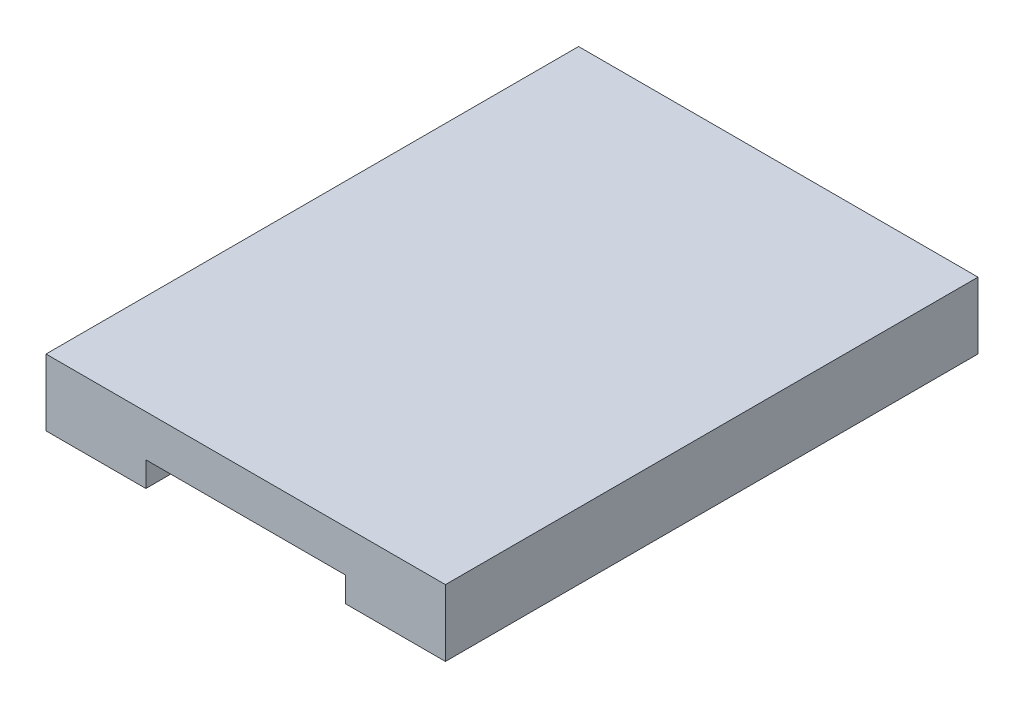
ISO-10303-21;
HEADER;
FILE_DESCRIPTION(('STEP AP214'),'2;1');
FILE_NAME('part.step','',(''),(''),'','','');
FILE_SCHEMA(('AUTOMOTIVE_DESIGN { 1 0 10303 214 1 1 1 1 }'));
ENDSEC;
DATA;
#1=APPLICATION_CONTEXT('core data for automotive mechanical design processes');
#2=APPLICATION_PROTOCOL_DEFINITION('international standard','automotive_design',2000,#1);
#3=PRODUCT_CONTEXT('',#1,'mechanical');
#4=PRODUCT('Part','Part','',(#3));
#5=PRODUCT_RELATED_PRODUCT_CATEGORY('part','',(#4));
#6=PRODUCT_DEFINITION_FORMATION('','',#4);
#7=PRODUCT_DEFINITION_CONTEXT('part definition',#1,'design');
#8=PRODUCT_DEFINITION('design','',#6,#7);
#9=PRODUCT_DEFINITION_SHAPE('','',#8);
#10=(LENGTH_UNIT() NAMED_UNIT(*) SI_UNIT(.MILLI.,.METRE.));
#11=(NAMED_UNIT(*) PLANE_ANGLE_UNIT() SI_UNIT($,.RADIAN.));
#12=(NAMED_UNIT(*) SI_UNIT($,.STERADIAN.) SOLID_ANGLE_UNIT());
#13=UNCERTAINTY_MEASURE_WITH_UNIT(LENGTH_MEASURE(1.E-05),#10,'distance_accuracy_value','');
#14=(GEOMETRIC_REPRESENTATION_CONTEXT(3) GLOBAL_UNCERTAINTY_ASSIGNED_CONTEXT((#13)) GLOBAL_UNIT_ASSIGNED_CONTEXT((#10,
#11,#12)) REPRESENTATION_CONTEXT('',''));
#15=CARTESIAN_POINT('',(0.,0.,0.));
#16=DIRECTION('',(0.,0.,1.));
#17=DIRECTION('',(1.,0.,0.));
#18=AXIS2_PLACEMENT_3D('',#15,#16,#17);
#19=CARTESIAN_POINT('',(38.1,12.7,-50.8));
#20=DIRECTION('',(-1.,0.,0.));
#21=DIRECTION('',(0.,0.,1.));
#22=AXIS2_PLACEMENT_3D('',#19,#20,#21);
#23=PLANE('',#22);
#24=DIRECTION('',(0.,0.,-1.));
#25=VECTOR('',#24,1.);
#26=CARTESIAN_POINT('',(38.1,0.,-50.8));
#27=LINE('',#26,#25);
#28=CARTESIAN_POINT('',(38.1,0.,50.8));
#29=VERTEX_POINT('',#28);
#30=CARTESIAN_POINT('',(38.1,0.,-50.8));
#31=VERTEX_POINT('',#30);
#32=EDGE_CURVE('E141',#29,#31,#27,.T.);
#33=ORIENTED_EDGE('',*,*,#32,.T.);
#34=DIRECTION('',(0.,-1.,0.));
#35=VECTOR('',#34,1.);
#36=CARTESIAN_POINT('',(38.1,12.7,-50.8));
#37=LINE('',#36,#35);
#38=CARTESIAN_POINT('',(38.1,12.7,-50.8));
#39=VERTEX_POINT('',#38);
#40=EDGE_CURVE('E11',#39,#31,#37,.T.);
#41=ORIENTED_EDGE('',*,*,#40,.F.);
#42=DIRECTION('',(0.,0.,-1.));
#43=VECTOR('',#42,1.);
#44=CARTESIAN_POINT('',(38.1,12.7,-50.8));
#45=LINE('',#44,#43);
#46=CARTESIAN_POINT('',(38.1,12.7,50.8));
#47=VERTEX_POINT('',#46);
#48=EDGE_CURVE('E145',#47,#39,#45,.T.);
#49=ORIENTED_EDGE('',*,*,#48,.F.);
#50=DIRECTION('',(0.,-1.,0.));
#51=VECTOR('',#50,1.);
#52=CARTESIAN_POINT('',(38.1,12.7,50.8));
#53=LINE('',#52,#51);
#54=EDGE_CURVE('E152',#47,#29,#53,.T.);
#55=ORIENTED_EDGE('',*,*,#54,.T.);
#56=EDGE_LOOP('',(#33,#41,#49,#55));
#57=FACE_BOUND('',#56,.T.);
#58=ADVANCED_FACE('F33',(#57),#23,.F.);
#59=CARTESIAN_POINT('',(-38.1,12.7,-50.8));
#60=DIRECTION('',(0.,0.,1.));
#61=DIRECTION('',(1.,0.,0.));
#62=AXIS2_PLACEMENT_3D('',#59,#60,#61);
#63=PLANE('',#62);
#64=CARTESIAN_POINT('',(0.,6.35,-50.8));
#65=DIRECTION('',(0.,0.,-1.));
#66=DIRECTION('',(-1.,0.,0.));
#67=AXIS2_PLACEMENT_3D('',#64,#65,#66);
#68=CIRCLE('',#67,3.81);
#69=CARTESIAN_POINT('',(-3.81000000000001,6.35,-50.8));
#70=VERTEX_POINT('',#69);
#71=EDGE_CURVE('E131',#70,#70,#68,.T.);
#72=ORIENTED_EDGE('',*,*,#71,.F.);
#73=EDGE_LOOP('',(#72));
#74=FACE_BOUND('',#73,.T.);
#75=DIRECTION('',(-1.,0.,0.));
#76=VECTOR('',#75,1.);
#77=CARTESIAN_POINT('',(-38.1,0.,-50.8));
#78=LINE('',#77,#76);
#79=CARTESIAN_POINT('',(-38.1,0.,-50.8));
#80=VERTEX_POINT('',#79);
#81=EDGE_CURVE('E155',#31,#80,#78,.T.);
#82=ORIENTED_EDGE('',*,*,#81,.T.);
#83=DIRECTION('',(0.,-1.,0.));
#84=VECTOR('',#83,1.);
#85=CARTESIAN_POINT('',(-38.1,12.7,-50.8));
#86=LINE('',#85,#84);
#87=CARTESIAN_POINT('',(-38.1,12.7,-50.8));
#88=VERTEX_POINT('',#87);
#89=EDGE_CURVE('E40',#88,#80,#86,.T.);
#90=ORIENTED_EDGE('',*,*,#89,.F.);
#91=DIRECTION('',(-1.,0.,0.));
#92=VECTOR('',#91,1.);
#93=CARTESIAN_POINT('',(-38.1,12.7,-50.8));
#94=LINE('',#93,#92);
#95=EDGE_CURVE('E84',#39,#88,#94,.T.);
#96=ORIENTED_EDGE('',*,*,#95,.F.);
#97=ORIENTED_EDGE('',*,*,#40,.T.);
#98=EDGE_LOOP('',(#82,#90,#96,#97));
#99=FACE_BOUND('',#98,.T.);
#100=ADVANCED_FACE('F189',(#74,#99),#63,.F.);
#101=CARTESIAN_POINT('',(-38.1,12.7,-50.8));
#102=DIRECTION('',(1.,0.,0.));
#103=DIRECTION('',(0.,0.,-1.));
#104=AXIS2_PLACEMENT_3D('',#101,#102,#103);
#105=PLANE('',#104);
#106=DIRECTION('',(0.,0.,1.));
#107=VECTOR('',#106,1.);
#108=CARTESIAN_POINT('',(-38.1,0.,-50.8));
#109=LINE('',#108,#107);
#110=CARTESIAN_POINT('',(-38.1,0.,50.8));
#111=VERTEX_POINT('',#110);
#112=EDGE_CURVE('E157',#80,#111,#109,.T.);
#113=ORIENTED_EDGE('',*,*,#112,.T.);
#114=DIRECTION('',(0.,-1.,0.));
#115=VECTOR('',#114,1.);
#116=CARTESIAN_POINT('',(-38.1,12.7,50.8));
#117=LINE('',#116,#115);
#118=CARTESIAN_POINT('',(-38.1,12.7,50.8));
#119=VERTEX_POINT('',#118);
#120=EDGE_CURVE('E162',#119,#111,#117,.T.);
#121=ORIENTED_EDGE('',*,*,#120,.F.);
#122=DIRECTION('',(0.,0.,1.));
#123=VECTOR('',#122,1.);
#124=CARTESIAN_POINT('',(-38.1,12.7,-50.8));
#125=LINE('',#124,#123);
#126=EDGE_CURVE('E149',#88,#119,#125,.T.);
#127=ORIENTED_EDGE('',*,*,#126,.F.);
#128=ORIENTED_EDGE('',*,*,#89,.T.);
#129=EDGE_LOOP('',(#113,#121,#127,#128));
#130=FACE_BOUND('',#129,.T.);
#131=ADVANCED_FACE('F168',(#130),#105,.F.);
#132=CARTESIAN_POINT('',(-38.1,12.7,50.8));
#133=DIRECTION('',(0.,0.,-1.));
#134=DIRECTION('',(-1.,0.,0.));
#135=AXIS2_PLACEMENT_3D('',#132,#133,#134);
#136=PLANE('',#135);
#137=DIRECTION('',(1.,0.,0.));
#138=VECTOR('',#137,1.);
#139=CARTESIAN_POINT('',(-38.1,0.,50.8));
#140=LINE('',#139,#138);
#141=CARTESIAN_POINT('',(-19.05,0.,50.8));
#142=VERTEX_POINT('',#141);
#143=EDGE_CURVE('E147',#111,#142,#140,.T.);
#144=ORIENTED_EDGE('',*,*,#143,.T.);
#145=DIRECTION('',(0.,-1.,0.));
#146=VECTOR('',#145,1.);
#147=CARTESIAN_POINT('',(-19.05,4.7498,50.8));
#148=LINE('',#147,#146);
#149=CARTESIAN_POINT('',(-19.05,4.7498,50.8));
#150=VERTEX_POINT('',#149);
#151=EDGE_CURVE('E139',#150,#142,#148,.T.);
#152=ORIENTED_EDGE('',*,*,#151,.F.);
#153=DIRECTION('',(-1.,0.,0.));
#154=VECTOR('',#153,1.);
#155=CARTESIAN_POINT('',(-19.05,4.7498,50.8));
#156=LINE('',#155,#154);
#157=CARTESIAN_POINT('',(19.05,4.7498,50.8));
#158=VERTEX_POINT('',#157);
#159=EDGE_CURVE('E113',#158,#150,#156,.T.);
#160=ORIENTED_EDGE('',*,*,#159,.F.);
#161=DIRECTION('',(0.,-1.,0.));
#162=VECTOR('',#161,1.);
#163=CARTESIAN_POINT('',(19.05,4.7498,50.8));
#164=LINE('',#163,#162);
#165=CARTESIAN_POINT('',(19.05,0.,50.8));
#166=VERTEX_POINT('',#165);
#167=EDGE_CURVE('E142',#158,#166,#164,.T.);
#168=ORIENTED_EDGE('',*,*,#167,.T.);
#169=EDGE_CURVE('E77',#166,#29,#140,.T.);
#170=ORIENTED_EDGE('',*,*,#169,.T.);
#171=ORIENTED_EDGE('',*,*,#54,.F.);
#172=DIRECTION('',(1.,0.,0.));
#173=VECTOR('',#172,1.);
#174=CARTESIAN_POINT('',(-38.1,12.7,50.8));
#175=LINE('',#174,#173);
#176=EDGE_CURVE('E56',#119,#47,#175,.T.);
#177=ORIENTED_EDGE('',*,*,#176,.F.);
#178=ORIENTED_EDGE('',*,*,#120,.T.);
#179=EDGE_LOOP('',(#144,#152,#160,#168,#170,#171,#177,#178));
#180=FACE_BOUND('',#179,.T.);
#181=ADVANCED_FACE('F174',(#180),#136,.F.);
#182=CARTESIAN_POINT('',(0.,12.7,0.));
#183=DIRECTION('',(0.,1.,0.));
#184=DIRECTION('',(0.,0.,1.));
#185=AXIS2_PLACEMENT_3D('',#182,#183,#184);
#186=PLANE('',#185);
#187=ORIENTED_EDGE('',*,*,#48,.T.);
#188=ORIENTED_EDGE('',*,*,#95,.T.);
#189=ORIENTED_EDGE('',*,*,#126,.T.);
#190=ORIENTED_EDGE('',*,*,#176,.T.);
#191=EDGE_LOOP('',(#187,#188,#189,#190));
#192=FACE_BOUND('',#191,.T.);
#193=ADVANCED_FACE('F178',(#192),#186,.T.);
#194=CARTESIAN_POINT('',(0.,0.,0.));
#195=DIRECTION('',(0.,1.,0.));
#196=DIRECTION('',(0.,0.,1.));
#197=AXIS2_PLACEMENT_3D('',#194,#195,#196);
#198=PLANE('',#197);
#199=DIRECTION('',(1.,0.,0.));
#200=VECTOR('',#199,1.);
#201=CARTESIAN_POINT('',(-19.05,0.,30.1498));
#202=LINE('',#201,#200);
#203=CARTESIAN_POINT('',(-19.05,0.,30.1498));
#204=VERTEX_POINT('',#203);
#205=CARTESIAN_POINT('',(19.05,0.,30.1498));
#206=VERTEX_POINT('',#205);
#207=EDGE_CURVE('E128',#204,#206,#202,.T.);
#208=ORIENTED_EDGE('',*,*,#207,.F.);
#209=DIRECTION('',(0.,0.,-1.));
#210=VECTOR('',#209,1.);
#211=CARTESIAN_POINT('',(-19.05,0.,50.8));
#212=LINE('',#211,#210);
#213=EDGE_CURVE('E47',#142,#204,#212,.T.);
#214=ORIENTED_EDGE('',*,*,#213,.F.);
#215=ORIENTED_EDGE('',*,*,#143,.F.);
#216=ORIENTED_EDGE('',*,*,#112,.F.);
#217=ORIENTED_EDGE('',*,*,#81,.F.);
#218=ORIENTED_EDGE('',*,*,#32,.F.);
#219=ORIENTED_EDGE('',*,*,#169,.F.);
#220=DIRECTION('',(0.,0.,1.));
#221=VECTOR('',#220,1.);
#222=CARTESIAN_POINT('',(19.05,0.,50.8));
#223=LINE('',#222,#221);
#224=EDGE_CURVE('E126',#206,#166,#223,.T.);
#225=ORIENTED_EDGE('',*,*,#224,.F.);
#226=EDGE_LOOP('',(#208,#214,#215,#216,#217,#218,#219,#225));
#227=FACE_BOUND('',#226,.T.);
#228=ADVANCED_FACE('F172',(#227),#198,.F.);
#229=CARTESIAN_POINT('',(-19.05,4.7498,50.8));
#230=DIRECTION('',(-1.,0.,0.));
#231=DIRECTION('',(0.,0.,1.));
#232=AXIS2_PLACEMENT_3D('',#229,#230,#231);
#233=PLANE('',#232);
#234=ORIENTED_EDGE('',*,*,#213,.T.);
#235=DIRECTION('',(0.,-1.,0.));
#236=VECTOR('',#235,1.);
#237=CARTESIAN_POINT('',(-19.05,4.7498,30.1498));
#238=LINE('',#237,#236);
#239=CARTESIAN_POINT('',(-19.05,4.7498,30.1498));
#240=VERTEX_POINT('',#239);
#241=EDGE_CURVE('E103',#240,#204,#238,.T.);
#242=ORIENTED_EDGE('',*,*,#241,.F.);
#243=DIRECTION('',(0.,0.,-1.));
#244=VECTOR('',#243,1.);
#245=CARTESIAN_POINT('',(-19.05,4.7498,50.8));
#246=LINE('',#245,#244);
#247=EDGE_CURVE('E107',#150,#240,#246,.T.);
#248=ORIENTED_EDGE('',*,*,#247,.F.);
#249=ORIENTED_EDGE('',*,*,#151,.T.);
#250=EDGE_LOOP('',(#234,#242,#248,#249));
#251=FACE_BOUND('',#250,.T.);
#252=ADVANCED_FACE('F105',(#251),#233,.F.);
#253=CARTESIAN_POINT('',(19.05,4.7498,50.8));
#254=DIRECTION('',(1.,0.,0.));
#255=DIRECTION('',(0.,0.,-1.));
#256=AXIS2_PLACEMENT_3D('',#253,#254,#255);
#257=PLANE('',#256);
#258=ORIENTED_EDGE('',*,*,#224,.T.);
#259=ORIENTED_EDGE('',*,*,#167,.F.);
#260=DIRECTION('',(0.,0.,1.));
#261=VECTOR('',#260,1.);
#262=CARTESIAN_POINT('',(19.05,4.7498,50.8));
#263=LINE('',#262,#261);
#264=CARTESIAN_POINT('',(19.05,4.7498,30.1498));
#265=VERTEX_POINT('',#264);
#266=EDGE_CURVE('E121',#265,#158,#263,.T.);
#267=ORIENTED_EDGE('',*,*,#266,.F.);
#268=DIRECTION('',(0.,-1.,0.));
#269=VECTOR('',#268,1.);
#270=CARTESIAN_POINT('',(19.05,4.7498,30.1498));
#271=LINE('',#270,#269);
#272=EDGE_CURVE('E112',#265,#206,#271,.T.);
#273=ORIENTED_EDGE('',*,*,#272,.T.);
#274=EDGE_LOOP('',(#258,#259,#267,#273));
#275=FACE_BOUND('',#274,.T.);
#276=ADVANCED_FACE('F202',(#275),#257,.F.);
#277=CARTESIAN_POINT('',(-19.05,4.7498,30.1498));
#278=DIRECTION('',(0.,0.,-1.));
#279=DIRECTION('',(-1.,0.,0.));
#280=AXIS2_PLACEMENT_3D('',#277,#278,#279);
#281=PLANE('',#280);
#282=ORIENTED_EDGE('',*,*,#207,.T.);
#283=ORIENTED_EDGE('',*,*,#272,.F.);
#284=DIRECTION('',(1.,0.,0.));
#285=VECTOR('',#284,1.);
#286=CARTESIAN_POINT('',(-19.05,4.7498,30.1498));
#287=LINE('',#286,#285);
#288=EDGE_CURVE('E116',#240,#265,#287,.T.);
#289=ORIENTED_EDGE('',*,*,#288,.F.);
#290=ORIENTED_EDGE('',*,*,#241,.T.);
#291=EDGE_LOOP('',(#282,#283,#289,#290));
#292=FACE_BOUND('',#291,.T.);
#293=ADVANCED_FACE('F117',(#292),#281,.F.);
#294=CARTESIAN_POINT('',(0.,4.7498,0.));
#295=DIRECTION('',(0.,-1.,0.));
#296=DIRECTION('',(0.,0.,-1.));
#297=AXIS2_PLACEMENT_3D('',#294,#295,#296);
#298=PLANE('',#297);
#299=ORIENTED_EDGE('',*,*,#247,.T.);
#300=ORIENTED_EDGE('',*,*,#288,.T.);
#301=ORIENTED_EDGE('',*,*,#266,.T.);
#302=ORIENTED_EDGE('',*,*,#159,.T.);
#303=EDGE_LOOP('',(#299,#300,#301,#302));
#304=FACE_BOUND('',#303,.T.);
#305=ADVANCED_FACE('F123',(#304),#298,.T.);
#306=CARTESIAN_POINT('',(0.,6.35,-44.45));
#307=DIRECTION('',(0.,0.,-1.));
#308=DIRECTION('',(-1.,0.,0.));
#309=AXIS2_PLACEMENT_3D('',#306,#307,#308);
#310=CYLINDRICAL_SURFACE('',#309,3.81);
#311=CARTESIAN_POINT('',(0.,6.35,-44.45));
#312=DIRECTION('',(0.,0.,-1.));
#313=DIRECTION('',(-1.,0.,0.));
#314=AXIS2_PLACEMENT_3D('',#311,#312,#313);
#315=CIRCLE('',#314,3.81);
#316=CARTESIAN_POINT('',(-3.81000000000001,6.35,-44.45));
#317=VERTEX_POINT('',#316);
#318=EDGE_CURVE('E137',#317,#317,#315,.T.);
#319=ORIENTED_EDGE('',*,*,#318,.F.);
#320=EDGE_LOOP('',(#319));
#321=FACE_BOUND('',#320,.T.);
#322=ORIENTED_EDGE('',*,*,#71,.T.);
#323=EDGE_LOOP('',(#322));
#324=FACE_BOUND('',#323,.T.);
#325=ADVANCED_FACE('F213',(#321,#324),#310,.F.);
#326=CARTESIAN_POINT('',(0.,6.35,-44.45));
#327=DIRECTION('',(0.,0.,-1.));
#328=DIRECTION('',(-1.,0.,0.));
#329=AXIS2_PLACEMENT_3D('',#326,#327,#328);
#330=PLANE('',#329);
#331=ORIENTED_EDGE('',*,*,#318,.T.);
#332=EDGE_LOOP('',(#331));
#333=FACE_BOUND('',#332,.T.);
#334=ADVANCED_FACE('F216',(#333),#330,.T.);
#335=CLOSED_SHELL('',(#58,#100,#131,#181,#193,#228,#252,#276,#293,#305,#325,#334));
#336=MANIFOLD_SOLID_BREP('B2',#335);
#337=ADVANCED_BREP_SHAPE_REPRESENTATION('',(#18,#336),#14);
#338=SHAPE_DEFINITION_REPRESENTATION(#9,#337);
ENDSEC;
END-ISO-10303-21;
